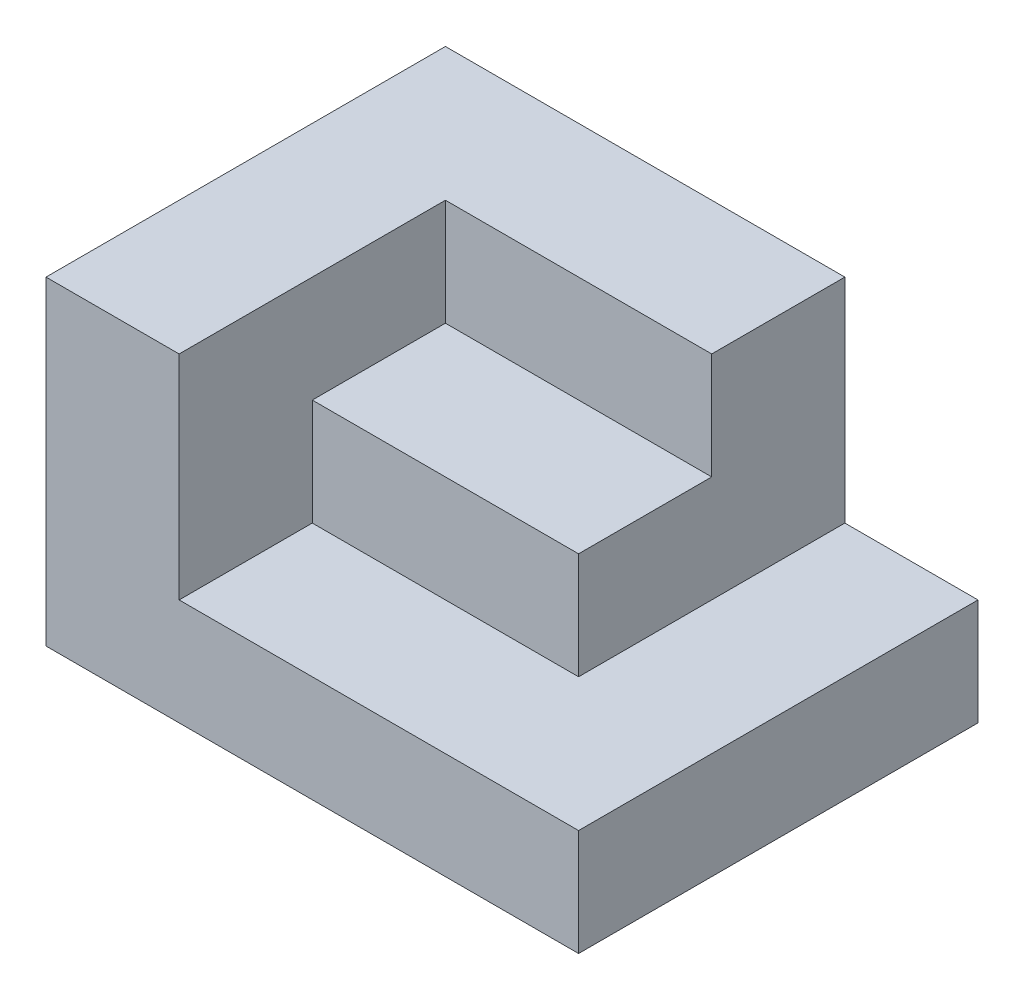
ISO-10303-21;
HEADER;
FILE_DESCRIPTION(('STEP AP214'),'2;1');
FILE_NAME('part.step','',(''),(''),'','','');
FILE_SCHEMA(('AUTOMOTIVE_DESIGN { 1 0 10303 214 1 1 1 1 }'));
ENDSEC;
DATA;
#1=APPLICATION_CONTEXT('core data for automotive mechanical design processes');
#2=APPLICATION_PROTOCOL_DEFINITION('international standard','automotive_design',2000,#1);
#3=PRODUCT_CONTEXT('',#1,'mechanical');
#4=PRODUCT('Part','Part','',(#3));
#5=PRODUCT_RELATED_PRODUCT_CATEGORY('part','',(#4));
#6=PRODUCT_DEFINITION_FORMATION('','',#4);
#7=PRODUCT_DEFINITION_CONTEXT('part definition',#1,'design');
#8=PRODUCT_DEFINITION('design','',#6,#7);
#9=PRODUCT_DEFINITION_SHAPE('','',#8);
#10=(LENGTH_UNIT() NAMED_UNIT(*) SI_UNIT(.MILLI.,.METRE.));
#11=(NAMED_UNIT(*) PLANE_ANGLE_UNIT() SI_UNIT($,.RADIAN.));
#12=(NAMED_UNIT(*) SI_UNIT($,.STERADIAN.) SOLID_ANGLE_UNIT());
#13=UNCERTAINTY_MEASURE_WITH_UNIT(LENGTH_MEASURE(1.E-05),#10,'distance_accuracy_value','');
#14=(GEOMETRIC_REPRESENTATION_CONTEXT(3) GLOBAL_UNCERTAINTY_ASSIGNED_CONTEXT((#13)) GLOBAL_UNIT_ASSIGNED_CONTEXT((#10,
#11,#12)) REPRESENTATION_CONTEXT('',''));
#15=CARTESIAN_POINT('',(0.,0.,0.));
#16=DIRECTION('',(0.,0.,1.));
#17=DIRECTION('',(1.,0.,0.));
#18=AXIS2_PLACEMENT_3D('',#15,#16,#17);
#19=CARTESIAN_POINT('',(50.,60.,37.5));
#20=DIRECTION('',(-1.,0.,0.));
#21=DIRECTION('',(0.,0.,1.));
#22=AXIS2_PLACEMENT_3D('',#19,#20,#21);
#23=PLANE('',#22);
#24=DIRECTION('',(0.,-1.,0.));
#25=VECTOR('',#24,1.);
#26=CARTESIAN_POINT('',(50.,60.,-37.5));
#27=LINE('',#26,#25);
#28=CARTESIAN_POINT('',(50.,20.,-37.5));
#29=VERTEX_POINT('',#28);
#30=CARTESIAN_POINT('',(50.,0.,-37.5));
#31=VERTEX_POINT('',#30);
#32=EDGE_CURVE('E11',#29,#31,#27,.T.);
#33=ORIENTED_EDGE('',*,*,#32,.F.);
#34=DIRECTION('',(0.,0.,-1.));
#35=VECTOR('',#34,1.);
#36=CARTESIAN_POINT('',(50.,20.,37.5));
#37=LINE('',#36,#35);
#38=CARTESIAN_POINT('',(50.,20.,37.5));
#39=VERTEX_POINT('',#38);
#40=EDGE_CURVE('E129',#39,#29,#37,.T.);
#41=ORIENTED_EDGE('',*,*,#40,.F.);
#42=DIRECTION('',(0.,-1.,0.));
#43=VECTOR('',#42,1.);
#44=CARTESIAN_POINT('',(50.,60.,37.5));
#45=LINE('',#44,#43);
#46=CARTESIAN_POINT('',(50.,0.,37.5));
#47=VERTEX_POINT('',#46);
#48=EDGE_CURVE('E169',#39,#47,#45,.T.);
#49=ORIENTED_EDGE('',*,*,#48,.T.);
#50=DIRECTION('',(0.,0.,-1.));
#51=VECTOR('',#50,1.);
#52=CARTESIAN_POINT('',(50.,0.,37.5));
#53=LINE('',#52,#51);
#54=EDGE_CURVE('E156',#47,#31,#53,.T.);
#55=ORIENTED_EDGE('',*,*,#54,.T.);
#56=EDGE_LOOP('',(#33,#41,#49,#55));
#57=FACE_BOUND('',#56,.T.);
#58=ADVANCED_FACE('F33',(#57),#23,.F.);
#59=CARTESIAN_POINT('',(-50.,60.,-37.5));
#60=DIRECTION('',(0.,0.,1.));
#61=DIRECTION('',(1.,0.,0.));
#62=AXIS2_PLACEMENT_3D('',#59,#60,#61);
#63=PLANE('',#62);
#64=DIRECTION('',(-1.,0.,0.));
#65=VECTOR('',#64,1.);
#66=CARTESIAN_POINT('',(-50.,60.,-37.5));
#67=LINE('',#66,#65);
#68=CARTESIAN_POINT('',(25.,60.,-37.5));
#69=VERTEX_POINT('',#68);
#70=CARTESIAN_POINT('',(-50.,60.,-37.5));
#71=VERTEX_POINT('',#70);
#72=EDGE_CURVE('E162',#69,#71,#67,.T.);
#73=ORIENTED_EDGE('',*,*,#72,.F.);
#74=DIRECTION('',(0.,-1.,0.));
#75=VECTOR('',#74,1.);
#76=CARTESIAN_POINT('',(25.,308.317807798276,-37.5));
#77=LINE('',#76,#75);
#78=CARTESIAN_POINT('',(25.,20.,-37.5));
#79=VERTEX_POINT('',#78);
#80=EDGE_CURVE('E152',#69,#79,#77,.T.);
#81=ORIENTED_EDGE('',*,*,#80,.T.);
#82=DIRECTION('',(-1.,0.,0.));
#83=VECTOR('',#82,1.);
#84=CARTESIAN_POINT('',(-50.,20.,-37.5));
#85=LINE('',#84,#83);
#86=EDGE_CURVE('E158',#29,#79,#85,.T.);
#87=ORIENTED_EDGE('',*,*,#86,.F.);
#88=ORIENTED_EDGE('',*,*,#32,.T.);
#89=DIRECTION('',(-1.,0.,0.));
#90=VECTOR('',#89,1.);
#91=CARTESIAN_POINT('',(-50.,0.,-37.5));
#92=LINE('',#91,#90);
#93=CARTESIAN_POINT('',(-50.,0.,-37.5));
#94=VERTEX_POINT('',#93);
#95=EDGE_CURVE('E172',#31,#94,#92,.T.);
#96=ORIENTED_EDGE('',*,*,#95,.T.);
#97=DIRECTION('',(0.,-1.,0.));
#98=VECTOR('',#97,1.);
#99=CARTESIAN_POINT('',(-50.,60.,-37.5));
#100=LINE('',#99,#98);
#101=EDGE_CURVE('E40',#71,#94,#100,.T.);
#102=ORIENTED_EDGE('',*,*,#101,.F.);
#103=EDGE_LOOP('',(#73,#81,#87,#88,#96,#102));
#104=FACE_BOUND('',#103,.T.);
#105=ADVANCED_FACE('F203',(#104),#63,.F.);
#106=CARTESIAN_POINT('',(-50.,60.,37.5));
#107=DIRECTION('',(1.,0.,0.));
#108=DIRECTION('',(0.,0.,-1.));
#109=AXIS2_PLACEMENT_3D('',#106,#107,#108);
#110=PLANE('',#109);
#111=DIRECTION('',(0.,0.,1.));
#112=VECTOR('',#111,1.);
#113=CARTESIAN_POINT('',(-50.,0.,37.5));
#114=LINE('',#113,#112);
#115=CARTESIAN_POINT('',(-50.,0.,37.5));
#116=VERTEX_POINT('',#115);
#117=EDGE_CURVE('E174',#94,#116,#114,.T.);
#118=ORIENTED_EDGE('',*,*,#117,.T.);
#119=DIRECTION('',(0.,-1.,0.));
#120=VECTOR('',#119,1.);
#121=CARTESIAN_POINT('',(-50.,60.,37.5));
#122=LINE('',#121,#120);
#123=CARTESIAN_POINT('',(-50.,60.,37.5));
#124=VERTEX_POINT('',#123);
#125=EDGE_CURVE('E179',#124,#116,#122,.T.);
#126=ORIENTED_EDGE('',*,*,#125,.F.);
#127=DIRECTION('',(0.,0.,1.));
#128=VECTOR('',#127,1.);
#129=CARTESIAN_POINT('',(-50.,60.,37.5));
#130=LINE('',#129,#128);
#131=EDGE_CURVE('E164',#71,#124,#130,.T.);
#132=ORIENTED_EDGE('',*,*,#131,.F.);
#133=ORIENTED_EDGE('',*,*,#101,.T.);
#134=EDGE_LOOP('',(#118,#126,#132,#133));
#135=FACE_BOUND('',#134,.T.);
#136=ADVANCED_FACE('F186',(#135),#110,.F.);
#137=CARTESIAN_POINT('',(-50.,60.,37.5));
#138=DIRECTION('',(0.,0.,-1.));
#139=DIRECTION('',(-1.,0.,0.));
#140=AXIS2_PLACEMENT_3D('',#137,#138,#139);
#141=PLANE('',#140);
#142=DIRECTION('',(1.,0.,0.));
#143=VECTOR('',#142,1.);
#144=CARTESIAN_POINT('',(-50.,20.,37.5));
#145=LINE('',#144,#143);
#146=CARTESIAN_POINT('',(-25.,20.,37.5));
#147=VERTEX_POINT('',#146);
#148=EDGE_CURVE('E147',#147,#39,#145,.T.);
#149=ORIENTED_EDGE('',*,*,#148,.F.);
#150=DIRECTION('',(0.,-1.,0.));
#151=VECTOR('',#150,1.);
#152=CARTESIAN_POINT('',(-25.,308.317807798276,37.5));
#153=LINE('',#152,#151);
#154=CARTESIAN_POINT('',(-25.,60.,37.5));
#155=VERTEX_POINT('',#154);
#156=EDGE_CURVE('E139',#155,#147,#153,.T.);
#157=ORIENTED_EDGE('',*,*,#156,.F.);
#158=DIRECTION('',(1.,0.,0.));
#159=VECTOR('',#158,1.);
#160=CARTESIAN_POINT('',(-50.,60.,37.5));
#161=LINE('',#160,#159);
#162=EDGE_CURVE('E167',#124,#155,#161,.T.);
#163=ORIENTED_EDGE('',*,*,#162,.F.);
#164=ORIENTED_EDGE('',*,*,#125,.T.);
#165=DIRECTION('',(1.,0.,0.));
#166=VECTOR('',#165,1.);
#167=CARTESIAN_POINT('',(-50.,0.,37.5));
#168=LINE('',#167,#166);
#169=EDGE_CURVE('E165',#116,#47,#168,.T.);
#170=ORIENTED_EDGE('',*,*,#169,.T.);
#171=ORIENTED_EDGE('',*,*,#48,.F.);
#172=EDGE_LOOP('',(#149,#157,#163,#164,#170,#171));
#173=FACE_BOUND('',#172,.T.);
#174=ADVANCED_FACE('F198',(#173),#141,.F.);
#175=CARTESIAN_POINT('',(0.,60.,0.));
#176=DIRECTION('',(0.,-1.,0.));
#177=DIRECTION('',(0.,0.,-1.));
#178=AXIS2_PLACEMENT_3D('',#175,#176,#177);
#179=PLANE('',#178);
#180=DIRECTION('',(0.,0.,1.));
#181=VECTOR('',#180,1.);
#182=CARTESIAN_POINT('',(-25.,60.,37.5));
#183=LINE('',#182,#181);
#184=CARTESIAN_POINT('',(-25.,60.,-12.5));
#185=VERTEX_POINT('',#184);
#186=EDGE_CURVE('E47',#185,#155,#183,.T.);
#187=ORIENTED_EDGE('',*,*,#186,.F.);
#188=DIRECTION('',(-1.,0.,0.));
#189=VECTOR('',#188,1.);
#190=CARTESIAN_POINT('',(-25.,60.,-12.5));
#191=LINE('',#190,#189);
#192=CARTESIAN_POINT('',(25.,60.,-12.5));
#193=VERTEX_POINT('',#192);
#194=EDGE_CURVE('E120',#193,#185,#191,.T.);
#195=ORIENTED_EDGE('',*,*,#194,.F.);
#196=DIRECTION('',(0.,0.,1.));
#197=VECTOR('',#196,1.);
#198=CARTESIAN_POINT('',(25.,60.,12.5));
#199=LINE('',#198,#197);
#200=EDGE_CURVE('E145',#69,#193,#199,.T.);
#201=ORIENTED_EDGE('',*,*,#200,.F.);
#202=ORIENTED_EDGE('',*,*,#72,.T.);
#203=ORIENTED_EDGE('',*,*,#131,.T.);
#204=ORIENTED_EDGE('',*,*,#162,.T.);
#205=EDGE_LOOP('',(#187,#195,#201,#202,#203,#204));
#206=FACE_BOUND('',#205,.T.);
#207=ADVANCED_FACE('F201',(#206),#179,.F.);
#208=CARTESIAN_POINT('',(0.,0.,0.));
#209=DIRECTION('',(0.,-1.,0.));
#210=DIRECTION('',(0.,0.,-1.));
#211=AXIS2_PLACEMENT_3D('',#208,#209,#210);
#212=PLANE('',#211);
#213=ORIENTED_EDGE('',*,*,#54,.F.);
#214=ORIENTED_EDGE('',*,*,#169,.F.);
#215=ORIENTED_EDGE('',*,*,#117,.F.);
#216=ORIENTED_EDGE('',*,*,#95,.F.);
#217=EDGE_LOOP('',(#213,#214,#215,#216));
#218=FACE_BOUND('',#217,.T.);
#219=ADVANCED_FACE('F194',(#218),#212,.T.);
#220=CARTESIAN_POINT('',(25.,308.317807798276,12.5));
#221=DIRECTION('',(-1.,0.,0.));
#222=DIRECTION('',(0.,0.,1.));
#223=AXIS2_PLACEMENT_3D('',#220,#221,#222);
#224=PLANE('',#223);
#225=DIRECTION('',(0.,0.,1.));
#226=VECTOR('',#225,1.);
#227=CARTESIAN_POINT('',(25.,20.,12.5));
#228=LINE('',#227,#226);
#229=CARTESIAN_POINT('',(25.,20.,12.5));
#230=VERTEX_POINT('',#229);
#231=EDGE_CURVE('E136',#79,#230,#228,.T.);
#232=ORIENTED_EDGE('',*,*,#231,.F.);
#233=ORIENTED_EDGE('',*,*,#80,.F.);
#234=ORIENTED_EDGE('',*,*,#200,.T.);
#235=DIRECTION('',(0.,-1.,0.));
#236=VECTOR('',#235,1.);
#237=CARTESIAN_POINT('',(25.,283.317807798276,-12.5));
#238=LINE('',#237,#236);
#239=CARTESIAN_POINT('',(25.,40.,-12.5));
#240=VERTEX_POINT('',#239);
#241=EDGE_CURVE('E55',#193,#240,#238,.T.);
#242=ORIENTED_EDGE('',*,*,#241,.T.);
#243=DIRECTION('',(0.,0.,1.));
#244=VECTOR('',#243,1.);
#245=CARTESIAN_POINT('',(25.,40.,12.5));
#246=LINE('',#245,#244);
#247=CARTESIAN_POINT('',(25.,40.,12.5));
#248=VERTEX_POINT('',#247);
#249=EDGE_CURVE('E124',#240,#248,#246,.T.);
#250=ORIENTED_EDGE('',*,*,#249,.T.);
#251=DIRECTION('',(0.,-1.,0.));
#252=VECTOR('',#251,1.);
#253=CARTESIAN_POINT('',(25.,308.317807798276,12.5));
#254=LINE('',#253,#252);
#255=EDGE_CURVE('E154',#248,#230,#254,.T.);
#256=ORIENTED_EDGE('',*,*,#255,.T.);
#257=EDGE_LOOP('',(#232,#233,#234,#242,#250,#256));
#258=FACE_BOUND('',#257,.T.);
#259=ADVANCED_FACE('F210',(#258),#224,.F.);
#260=CARTESIAN_POINT('',(-25.,308.317807798276,12.5));
#261=DIRECTION('',(0.,0.,-1.));
#262=DIRECTION('',(-1.,0.,0.));
#263=AXIS2_PLACEMENT_3D('',#260,#261,#262);
#264=PLANE('',#263);
#265=ORIENTED_EDGE('',*,*,#255,.F.);
#266=DIRECTION('',(-1.,0.,0.));
#267=VECTOR('',#266,1.);
#268=CARTESIAN_POINT('',(-25.,40.,12.5));
#269=LINE('',#268,#267);
#270=CARTESIAN_POINT('',(-25.,40.,12.5));
#271=VERTEX_POINT('',#270);
#272=EDGE_CURVE('E133',#248,#271,#269,.T.);
#273=ORIENTED_EDGE('',*,*,#272,.T.);
#274=DIRECTION('',(0.,-1.,0.));
#275=VECTOR('',#274,1.);
#276=CARTESIAN_POINT('',(-25.,308.317807798276,12.5));
#277=LINE('',#276,#275);
#278=CARTESIAN_POINT('',(-25.,20.,12.5));
#279=VERTEX_POINT('',#278);
#280=EDGE_CURVE('E115',#271,#279,#277,.T.);
#281=ORIENTED_EDGE('',*,*,#280,.T.);
#282=DIRECTION('',(-1.,0.,0.));
#283=VECTOR('',#282,1.);
#284=CARTESIAN_POINT('',(-25.,20.,12.5));
#285=LINE('',#284,#283);
#286=EDGE_CURVE('E140',#230,#279,#285,.T.);
#287=ORIENTED_EDGE('',*,*,#286,.F.);
#288=EDGE_LOOP('',(#265,#273,#281,#287));
#289=FACE_BOUND('',#288,.T.);
#290=ADVANCED_FACE('F214',(#289),#264,.F.);
#291=CARTESIAN_POINT('',(-25.,308.317807798276,37.5));
#292=DIRECTION('',(-1.,0.,0.));
#293=DIRECTION('',(0.,0.,1.));
#294=AXIS2_PLACEMENT_3D('',#291,#292,#293);
#295=PLANE('',#294);
#296=ORIENTED_EDGE('',*,*,#186,.T.);
#297=ORIENTED_EDGE('',*,*,#156,.T.);
#298=DIRECTION('',(0.,0.,1.));
#299=VECTOR('',#298,1.);
#300=CARTESIAN_POINT('',(-25.,20.,37.5));
#301=LINE('',#300,#299);
#302=EDGE_CURVE('E141',#279,#147,#301,.T.);
#303=ORIENTED_EDGE('',*,*,#302,.F.);
#304=ORIENTED_EDGE('',*,*,#280,.F.);
#305=DIRECTION('',(0.,0.,1.));
#306=VECTOR('',#305,1.);
#307=CARTESIAN_POINT('',(-25.,40.,12.5));
#308=LINE('',#307,#306);
#309=CARTESIAN_POINT('',(-25.,40.,-12.5));
#310=VERTEX_POINT('',#309);
#311=EDGE_CURVE('E108',#310,#271,#308,.T.);
#312=ORIENTED_EDGE('',*,*,#311,.F.);
#313=DIRECTION('',(0.,-1.,0.));
#314=VECTOR('',#313,1.);
#315=CARTESIAN_POINT('',(-25.,283.317807798276,-12.5));
#316=LINE('',#315,#314);
#317=EDGE_CURVE('E112',#185,#310,#316,.T.);
#318=ORIENTED_EDGE('',*,*,#317,.F.);
#319=EDGE_LOOP('',(#296,#297,#303,#304,#312,#318));
#320=FACE_BOUND('',#319,.T.);
#321=ADVANCED_FACE('F110',(#320),#295,.F.);
#322=CARTESIAN_POINT('',(0.,20.,0.));
#323=DIRECTION('',(0.,-1.,0.));
#324=DIRECTION('',(0.,0.,-1.));
#325=AXIS2_PLACEMENT_3D('',#322,#323,#324);
#326=PLANE('',#325);
#327=ORIENTED_EDGE('',*,*,#302,.T.);
#328=ORIENTED_EDGE('',*,*,#148,.T.);
#329=ORIENTED_EDGE('',*,*,#40,.T.);
#330=ORIENTED_EDGE('',*,*,#86,.T.);
#331=ORIENTED_EDGE('',*,*,#231,.T.);
#332=ORIENTED_EDGE('',*,*,#286,.T.);
#333=EDGE_LOOP('',(#327,#328,#329,#330,#331,#332));
#334=FACE_BOUND('',#333,.T.);
#335=ADVANCED_FACE('F208',(#334),#326,.F.);
#336=CARTESIAN_POINT('',(-25.,283.317807798276,-12.5));
#337=DIRECTION('',(0.,0.,-1.));
#338=DIRECTION('',(-1.,0.,0.));
#339=AXIS2_PLACEMENT_3D('',#336,#337,#338);
#340=PLANE('',#339);
#341=ORIENTED_EDGE('',*,*,#194,.T.);
#342=ORIENTED_EDGE('',*,*,#317,.T.);
#343=DIRECTION('',(-1.,0.,0.));
#344=VECTOR('',#343,1.);
#345=CARTESIAN_POINT('',(-25.,40.,-12.5));
#346=LINE('',#345,#344);
#347=EDGE_CURVE('E119',#240,#310,#346,.T.);
#348=ORIENTED_EDGE('',*,*,#347,.F.);
#349=ORIENTED_EDGE('',*,*,#241,.F.);
#350=EDGE_LOOP('',(#341,#342,#348,#349));
#351=FACE_BOUND('',#350,.T.);
#352=ADVANCED_FACE('F127',(#351),#340,.F.);
#353=CARTESIAN_POINT('',(0.,40.,0.));
#354=DIRECTION('',(0.,-1.,0.));
#355=DIRECTION('',(0.,0.,-1.));
#356=AXIS2_PLACEMENT_3D('',#353,#354,#355);
#357=PLANE('',#356);
#358=ORIENTED_EDGE('',*,*,#311,.T.);
#359=ORIENTED_EDGE('',*,*,#272,.F.);
#360=ORIENTED_EDGE('',*,*,#249,.F.);
#361=ORIENTED_EDGE('',*,*,#347,.T.);
#362=EDGE_LOOP('',(#358,#359,#360,#361));
#363=FACE_BOUND('',#362,.T.);
#364=ADVANCED_FACE('F123',(#363),#357,.F.);
#365=CLOSED_SHELL('',(#58,#105,#136,#174,#207,#219,#259,#290,#321,#335,#352,#364));
#366=MANIFOLD_SOLID_BREP('B2',#365);
#367=ADVANCED_BREP_SHAPE_REPRESENTATION('',(#18,#366),#14);
#368=SHAPE_DEFINITION_REPRESENTATION(#9,#367);
ENDSEC;
END-ISO-10303-21;
